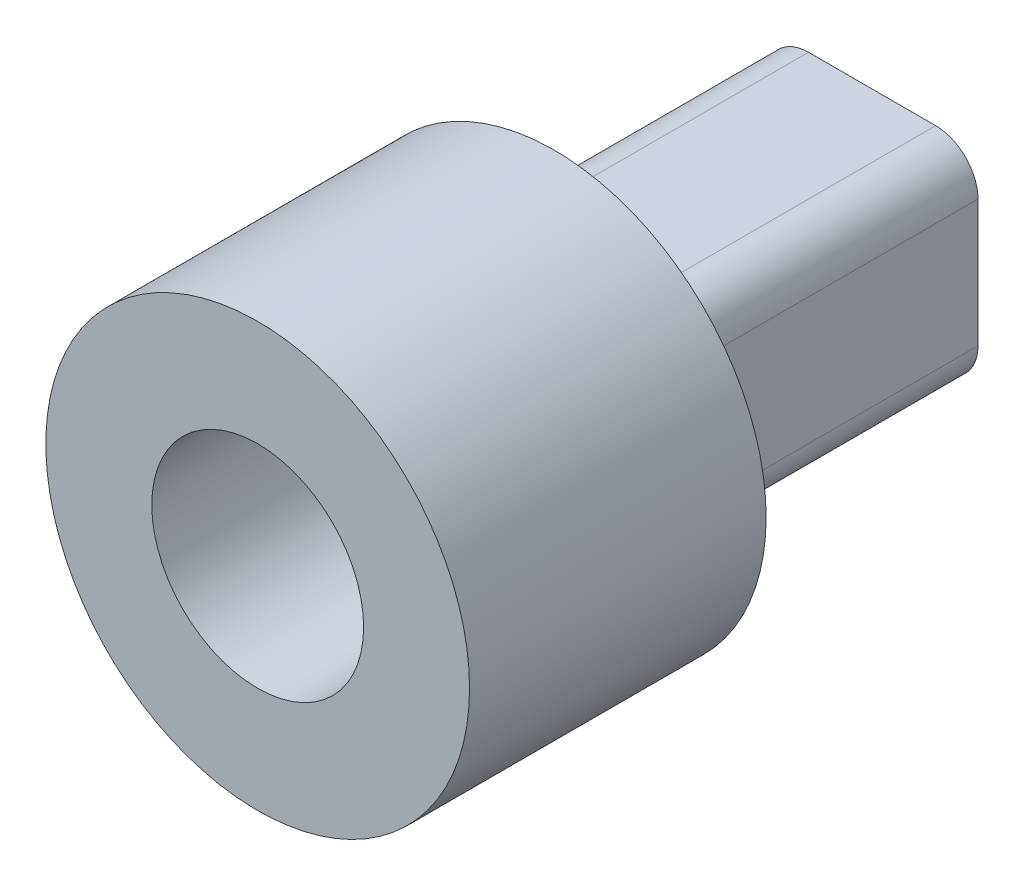
ISO-10303-21;
HEADER;
FILE_DESCRIPTION(('STEP AP214'),'2;1');
FILE_NAME('part.step','',(''),(''),'','','');
FILE_SCHEMA(('AUTOMOTIVE_DESIGN { 1 0 10303 214 1 1 1 1 }'));
ENDSEC;
DATA;
#1=APPLICATION_CONTEXT('core data for automotive mechanical design processes');
#2=APPLICATION_PROTOCOL_DEFINITION('international standard','automotive_design',2000,#1);
#3=PRODUCT_CONTEXT('',#1,'mechanical');
#4=PRODUCT('Part','Part','',(#3));
#5=PRODUCT_RELATED_PRODUCT_CATEGORY('part','',(#4));
#6=PRODUCT_DEFINITION_FORMATION('','',#4);
#7=PRODUCT_DEFINITION_CONTEXT('part definition',#1,'design');
#8=PRODUCT_DEFINITION('design','',#6,#7);
#9=PRODUCT_DEFINITION_SHAPE('','',#8);
#10=(LENGTH_UNIT() NAMED_UNIT(*) SI_UNIT(.MILLI.,.METRE.));
#11=(NAMED_UNIT(*) PLANE_ANGLE_UNIT() SI_UNIT($,.RADIAN.));
#12=(NAMED_UNIT(*) SI_UNIT($,.STERADIAN.) SOLID_ANGLE_UNIT());
#13=UNCERTAINTY_MEASURE_WITH_UNIT(LENGTH_MEASURE(1.E-05),#10,'distance_accuracy_value','');
#14=(GEOMETRIC_REPRESENTATION_CONTEXT(3) GLOBAL_UNCERTAINTY_ASSIGNED_CONTEXT((#13)) GLOBAL_UNIT_ASSIGNED_CONTEXT((#10,
#11,#12)) REPRESENTATION_CONTEXT('',''));
#15=CARTESIAN_POINT('',(0.,0.,0.));
#16=DIRECTION('',(0.,0.,1.));
#17=DIRECTION('',(1.,0.,0.));
#18=AXIS2_PLACEMENT_3D('',#15,#16,#17);
#19=CARTESIAN_POINT('',(1.5,1.50000000000001,7.5));
#20=DIRECTION('',(0.,0.,-1.));
#21=DIRECTION('',(-1.,0.,0.));
#22=AXIS2_PLACEMENT_3D('',#19,#20,#21);
#23=CYLINDRICAL_SURFACE('',#22,1.);
#24=DIRECTION('',(0.,0.,-1.));
#25=VECTOR('',#24,1.);
#26=CARTESIAN_POINT('',(1.5,2.50000000000001,7.5));
#27=LINE('',#26,#25);
#28=CARTESIAN_POINT('',(1.5,2.50000000000001,6.5));
#29=VERTEX_POINT('',#28);
#30=CARTESIAN_POINT('',(1.5,2.50000000000001,0.));
#31=VERTEX_POINT('',#30);
#32=EDGE_CURVE('E128',#29,#31,#27,.T.);
#33=ORIENTED_EDGE('',*,*,#32,.F.);
#34=CARTESIAN_POINT('',(1.5,1.50000000000001,6.5));
#35=DIRECTION('',(0.,0.,1.));
#36=DIRECTION('',(1.,0.,0.));
#37=AXIS2_PLACEMENT_3D('',#34,#35,#36);
#38=CIRCLE('',#37,1.);
#39=CARTESIAN_POINT('',(2.5,1.5,6.5));
#40=VERTEX_POINT('',#39);
#41=EDGE_CURVE('E207',#29,#40,#38,.F.);
#42=ORIENTED_EDGE('',*,*,#41,.T.);
#43=DIRECTION('',(0.,0.,-1.));
#44=VECTOR('',#43,1.);
#45=CARTESIAN_POINT('',(2.5,1.5,7.5));
#46=LINE('',#45,#44);
#47=CARTESIAN_POINT('',(2.5,1.5,0.));
#48=VERTEX_POINT('',#47);
#49=EDGE_CURVE('E151',#40,#48,#46,.T.);
#50=ORIENTED_EDGE('',*,*,#49,.T.);
#51=CARTESIAN_POINT('',(1.5,1.50000000000001,0.));
#52=DIRECTION('',(0.,0.,1.));
#53=DIRECTION('',(-1.,0.,0.));
#54=AXIS2_PLACEMENT_3D('',#51,#52,#53);
#55=CIRCLE('',#54,1.);
#56=EDGE_CURVE('E145',#48,#31,#55,.T.);
#57=ORIENTED_EDGE('',*,*,#56,.T.);
#58=EDGE_LOOP('',(#33,#42,#50,#57));
#59=FACE_BOUND('',#58,.T.);
#60=ADVANCED_FACE('F37',(#59),#23,.T.);
#61=CARTESIAN_POINT('',(-1.49999999999999,2.50000000000001,7.5));
#62=DIRECTION('',(0.,-1.,0.));
#63=DIRECTION('',(0.,0.,-1.));
#64=AXIS2_PLACEMENT_3D('',#61,#62,#63);
#65=PLANE('',#64);
#66=DIRECTION('',(0.,0.,-1.));
#67=VECTOR('',#66,1.);
#68=CARTESIAN_POINT('',(-1.49999999999999,2.50000000000001,7.5));
#69=LINE('',#68,#67);
#70=CARTESIAN_POINT('',(-1.49999999999999,2.50000000000001,6.5));
#71=VERTEX_POINT('',#70);
#72=CARTESIAN_POINT('',(-1.49999999999999,2.50000000000001,0.));
#73=VERTEX_POINT('',#72);
#74=EDGE_CURVE('E139',#71,#73,#69,.T.);
#75=ORIENTED_EDGE('',*,*,#74,.F.);
#76=DIRECTION('',(-1.,0.,0.));
#77=VECTOR('',#76,1.);
#78=CARTESIAN_POINT('',(1.5,2.50000000000001,6.5));
#79=LINE('',#78,#77);
#80=EDGE_CURVE('E135',#71,#29,#79,.F.);
#81=ORIENTED_EDGE('',*,*,#80,.T.);
#82=ORIENTED_EDGE('',*,*,#32,.T.);
#83=DIRECTION('',(-1.,0.,0.));
#84=VECTOR('',#83,1.);
#85=CARTESIAN_POINT('',(-1.49999999999999,2.50000000000001,0.));
#86=LINE('',#85,#84);
#87=EDGE_CURVE('E132',#31,#73,#86,.T.);
#88=ORIENTED_EDGE('',*,*,#87,.T.);
#89=EDGE_LOOP('',(#75,#81,#82,#88));
#90=FACE_BOUND('',#89,.T.);
#91=ADVANCED_FACE('F131',(#90),#65,.F.);
#92=CARTESIAN_POINT('',(-1.5,1.50000000000001,7.5));
#93=DIRECTION('',(0.,0.,-1.));
#94=DIRECTION('',(-1.,0.,0.));
#95=AXIS2_PLACEMENT_3D('',#92,#93,#94);
#96=CYLINDRICAL_SURFACE('',#95,1.);
#97=DIRECTION('',(0.,0.,-1.));
#98=VECTOR('',#97,1.);
#99=CARTESIAN_POINT('',(-2.5,1.5,7.5));
#100=LINE('',#99,#98);
#101=CARTESIAN_POINT('',(-2.5,1.5,6.5));
#102=VERTEX_POINT('',#101);
#103=CARTESIAN_POINT('',(-2.5,1.5,0.));
#104=VERTEX_POINT('',#103);
#105=EDGE_CURVE('E184',#102,#104,#100,.T.);
#106=ORIENTED_EDGE('',*,*,#105,.F.);
#107=CARTESIAN_POINT('',(-1.5,1.50000000000001,6.5));
#108=DIRECTION('',(0.,0.,1.));
#109=DIRECTION('',(1.,0.,0.));
#110=AXIS2_PLACEMENT_3D('',#107,#108,#109);
#111=CIRCLE('',#110,1.);
#112=EDGE_CURVE('E11',#102,#71,#111,.F.);
#113=ORIENTED_EDGE('',*,*,#112,.T.);
#114=ORIENTED_EDGE('',*,*,#74,.T.);
#115=CARTESIAN_POINT('',(-1.5,1.50000000000001,0.));
#116=DIRECTION('',(0.,0.,1.));
#117=DIRECTION('',(-1.,0.,0.));
#118=AXIS2_PLACEMENT_3D('',#115,#116,#117);
#119=CIRCLE('',#118,1.);
#120=EDGE_CURVE('E148',#73,#104,#119,.T.);
#121=ORIENTED_EDGE('',*,*,#120,.T.);
#122=EDGE_LOOP('',(#106,#113,#114,#121));
#123=FACE_BOUND('',#122,.T.);
#124=ADVANCED_FACE('F271',(#123),#96,.T.);
#125=CARTESIAN_POINT('',(-2.5,-1.49999999999999,7.5));
#126=DIRECTION('',(1.,0.,0.));
#127=DIRECTION('',(0.,0.,-1.));
#128=AXIS2_PLACEMENT_3D('',#125,#126,#127);
#129=PLANE('',#128);
#130=DIRECTION('',(0.,0.,-1.));
#131=VECTOR('',#130,1.);
#132=CARTESIAN_POINT('',(-2.5,-1.49999999999999,7.5));
#133=LINE('',#132,#131);
#134=CARTESIAN_POINT('',(-2.5,-1.49999999999999,6.5));
#135=VERTEX_POINT('',#134);
#136=CARTESIAN_POINT('',(-2.5,-1.49999999999999,0.));
#137=VERTEX_POINT('',#136);
#138=EDGE_CURVE('E182',#135,#137,#133,.T.);
#139=ORIENTED_EDGE('',*,*,#138,.F.);
#140=DIRECTION('',(0.,-1.,0.));
#141=VECTOR('',#140,1.);
#142=CARTESIAN_POINT('',(-2.5,1.5,6.5));
#143=LINE('',#142,#141);
#144=EDGE_CURVE('E46',#135,#102,#143,.F.);
#145=ORIENTED_EDGE('',*,*,#144,.T.);
#146=ORIENTED_EDGE('',*,*,#105,.T.);
#147=DIRECTION('',(0.,-1.,0.));
#148=VECTOR('',#147,1.);
#149=CARTESIAN_POINT('',(-2.5,-1.49999999999999,0.));
#150=LINE('',#149,#148);
#151=EDGE_CURVE('E161',#104,#137,#150,.T.);
#152=ORIENTED_EDGE('',*,*,#151,.T.);
#153=EDGE_LOOP('',(#139,#145,#146,#152));
#154=FACE_BOUND('',#153,.T.);
#155=ADVANCED_FACE('F338',(#154),#129,.F.);
#156=CARTESIAN_POINT('',(-1.5,-1.5,7.5));
#157=DIRECTION('',(0.,0.,-1.));
#158=DIRECTION('',(-1.,0.,0.));
#159=AXIS2_PLACEMENT_3D('',#156,#157,#158);
#160=CYLINDRICAL_SURFACE('',#159,1.);
#161=DIRECTION('',(0.,0.,-1.));
#162=VECTOR('',#161,1.);
#163=CARTESIAN_POINT('',(-1.49999999999999,-2.5,7.5));
#164=LINE('',#163,#162);
#165=CARTESIAN_POINT('',(-1.49999999999999,-2.5,6.5));
#166=VERTEX_POINT('',#165);
#167=CARTESIAN_POINT('',(-1.49999999999999,-2.5,0.));
#168=VERTEX_POINT('',#167);
#169=EDGE_CURVE('E180',#166,#168,#164,.T.);
#170=ORIENTED_EDGE('',*,*,#169,.F.);
#171=CARTESIAN_POINT('',(-1.5,-1.5,6.5));
#172=DIRECTION('',(0.,0.,1.));
#173=DIRECTION('',(1.,0.,0.));
#174=AXIS2_PLACEMENT_3D('',#171,#172,#173);
#175=CIRCLE('',#174,1.);
#176=EDGE_CURVE('E61',#166,#135,#175,.F.);
#177=ORIENTED_EDGE('',*,*,#176,.T.);
#178=ORIENTED_EDGE('',*,*,#138,.T.);
#179=CARTESIAN_POINT('',(-1.5,-1.5,0.));
#180=DIRECTION('',(0.,0.,1.));
#181=DIRECTION('',(-1.,0.,0.));
#182=AXIS2_PLACEMENT_3D('',#179,#180,#181);
#183=CIRCLE('',#182,1.);
#184=EDGE_CURVE('E164',#137,#168,#183,.T.);
#185=ORIENTED_EDGE('',*,*,#184,.T.);
#186=EDGE_LOOP('',(#170,#177,#178,#185));
#187=FACE_BOUND('',#186,.T.);
#188=ADVANCED_FACE('F337',(#187),#160,.T.);
#189=CARTESIAN_POINT('',(-1.49999999999999,-2.5,7.5));
#190=DIRECTION('',(0.,1.,0.));
#191=DIRECTION('',(0.,0.,1.));
#192=AXIS2_PLACEMENT_3D('',#189,#190,#191);
#193=PLANE('',#192);
#194=DIRECTION('',(0.,0.,-1.));
#195=VECTOR('',#194,1.);
#196=CARTESIAN_POINT('',(1.5,-2.5,7.5));
#197=LINE('',#196,#195);
#198=CARTESIAN_POINT('',(1.5,-2.5,6.5));
#199=VERTEX_POINT('',#198);
#200=CARTESIAN_POINT('',(1.5,-2.5,0.));
#201=VERTEX_POINT('',#200);
#202=EDGE_CURVE('E178',#199,#201,#197,.T.);
#203=ORIENTED_EDGE('',*,*,#202,.F.);
#204=DIRECTION('',(1.,0.,0.));
#205=VECTOR('',#204,1.);
#206=CARTESIAN_POINT('',(-1.49999999999999,-2.5,6.5));
#207=LINE('',#206,#205);
#208=EDGE_CURVE('E213',#199,#166,#207,.F.);
#209=ORIENTED_EDGE('',*,*,#208,.T.);
#210=ORIENTED_EDGE('',*,*,#169,.T.);
#211=DIRECTION('',(1.,0.,0.));
#212=VECTOR('',#211,1.);
#213=CARTESIAN_POINT('',(-1.49999999999999,-2.5,0.));
#214=LINE('',#213,#212);
#215=EDGE_CURVE('E167',#168,#201,#214,.T.);
#216=ORIENTED_EDGE('',*,*,#215,.T.);
#217=EDGE_LOOP('',(#203,#209,#210,#216));
#218=FACE_BOUND('',#217,.T.);
#219=ADVANCED_FACE('F333',(#218),#193,.F.);
#220=CARTESIAN_POINT('',(1.5,-1.5,7.5));
#221=DIRECTION('',(0.,0.,-1.));
#222=DIRECTION('',(-1.,0.,0.));
#223=AXIS2_PLACEMENT_3D('',#220,#221,#222);
#224=CYLINDRICAL_SURFACE('',#223,1.);
#225=DIRECTION('',(0.,0.,-1.));
#226=VECTOR('',#225,1.);
#227=CARTESIAN_POINT('',(2.5,-1.5,7.5));
#228=LINE('',#227,#226);
#229=CARTESIAN_POINT('',(2.5,-1.5,6.5));
#230=VERTEX_POINT('',#229);
#231=CARTESIAN_POINT('',(2.5,-1.5,0.));
#232=VERTEX_POINT('',#231);
#233=EDGE_CURVE('E176',#230,#232,#228,.T.);
#234=ORIENTED_EDGE('',*,*,#233,.F.);
#235=CARTESIAN_POINT('',(1.5,-1.5,6.5));
#236=DIRECTION('',(0.,0.,1.));
#237=DIRECTION('',(1.,0.,0.));
#238=AXIS2_PLACEMENT_3D('',#235,#236,#237);
#239=CIRCLE('',#238,1.);
#240=EDGE_CURVE('E211',#230,#199,#239,.F.);
#241=ORIENTED_EDGE('',*,*,#240,.T.);
#242=ORIENTED_EDGE('',*,*,#202,.T.);
#243=CARTESIAN_POINT('',(1.5,-1.5,0.));
#244=DIRECTION('',(0.,0.,1.));
#245=DIRECTION('',(1.,0.,0.));
#246=AXIS2_PLACEMENT_3D('',#243,#244,#245);
#247=CIRCLE('',#246,1.);
#248=EDGE_CURVE('E170',#201,#232,#247,.T.);
#249=ORIENTED_EDGE('',*,*,#248,.T.);
#250=EDGE_LOOP('',(#234,#241,#242,#249));
#251=FACE_BOUND('',#250,.T.);
#252=ADVANCED_FACE('F331',(#251),#224,.T.);
#253=CARTESIAN_POINT('',(2.5,-1.49999999999999,7.5));
#254=DIRECTION('',(-1.,0.,0.));
#255=DIRECTION('',(0.,0.,1.));
#256=AXIS2_PLACEMENT_3D('',#253,#254,#255);
#257=PLANE('',#256);
#258=ORIENTED_EDGE('',*,*,#49,.F.);
#259=DIRECTION('',(0.,1.,0.));
#260=VECTOR('',#259,1.);
#261=CARTESIAN_POINT('',(2.5,-1.5,6.5));
#262=LINE('',#261,#260);
#263=EDGE_CURVE('E209',#40,#230,#262,.F.);
#264=ORIENTED_EDGE('',*,*,#263,.T.);
#265=ORIENTED_EDGE('',*,*,#233,.T.);
#266=DIRECTION('',(0.,1.,0.));
#267=VECTOR('',#266,1.);
#268=CARTESIAN_POINT('',(2.5,-1.49999999999999,0.));
#269=LINE('',#268,#267);
#270=EDGE_CURVE('E173',#232,#48,#269,.T.);
#271=ORIENTED_EDGE('',*,*,#270,.T.);
#272=EDGE_LOOP('',(#258,#264,#265,#271));
#273=FACE_BOUND('',#272,.T.);
#274=ADVANCED_FACE('F325',(#273),#257,.F.);
#275=CARTESIAN_POINT('',(1.5,1.50000000000001,0.));
#276=DIRECTION('',(0.,0.,-1.));
#277=DIRECTION('',(-1.,0.,0.));
#278=AXIS2_PLACEMENT_3D('',#275,#276,#277);
#279=PLANE('',#278);
#280=ORIENTED_EDGE('',*,*,#56,.F.);
#281=ORIENTED_EDGE('',*,*,#270,.F.);
#282=ORIENTED_EDGE('',*,*,#248,.F.);
#283=ORIENTED_EDGE('',*,*,#215,.F.);
#284=ORIENTED_EDGE('',*,*,#184,.F.);
#285=ORIENTED_EDGE('',*,*,#151,.F.);
#286=ORIENTED_EDGE('',*,*,#120,.F.);
#287=ORIENTED_EDGE('',*,*,#87,.F.);
#288=EDGE_LOOP('',(#280,#281,#282,#283,#284,#285,#286,#287));
#289=FACE_BOUND('',#288,.T.);
#290=ADVANCED_FACE('F143',(#289),#279,.T.);
#291=CARTESIAN_POINT('',(0.,0.,7.5));
#292=DIRECTION('',(0.,0.,1.));
#293=DIRECTION('',(1.,0.,0.));
#294=AXIS2_PLACEMENT_3D('',#291,#292,#293);
#295=PLANE('',#294);
#296=CARTESIAN_POINT('',(1.5,1.50000000000001,7.5));
#297=DIRECTION('',(0.,0.,1.));
#298=DIRECTION('',(1.,0.,0.));
#299=AXIS2_PLACEMENT_3D('',#296,#297,#298);
#300=CIRCLE('',#299,2.);
#301=CARTESIAN_POINT('',(3.5,1.49999999999999,7.5));
#302=VERTEX_POINT('',#301);
#303=CARTESIAN_POINT('',(1.5,3.50000000000001,7.5));
#304=VERTEX_POINT('',#303);
#305=EDGE_CURVE('E201',#302,#304,#300,.T.);
#306=ORIENTED_EDGE('',*,*,#305,.T.);
#307=DIRECTION('',(-1.,0.,0.));
#308=VECTOR('',#307,1.);
#309=CARTESIAN_POINT('',(-1.49999999999999,3.50000000000001,7.5));
#310=LINE('',#309,#308);
#311=CARTESIAN_POINT('',(-1.49999999999999,3.50000000000001,7.5));
#312=VERTEX_POINT('',#311);
#313=EDGE_CURVE('E203',#304,#312,#310,.T.);
#314=ORIENTED_EDGE('',*,*,#313,.T.);
#315=CARTESIAN_POINT('',(-1.5,1.50000000000001,7.5));
#316=DIRECTION('',(0.,0.,1.));
#317=DIRECTION('',(1.,0.,0.));
#318=AXIS2_PLACEMENT_3D('',#315,#316,#317);
#319=CIRCLE('',#318,2.);
#320=CARTESIAN_POINT('',(-3.5,1.5,7.5));
#321=VERTEX_POINT('',#320);
#322=EDGE_CURVE('E189',#312,#321,#319,.T.);
#323=ORIENTED_EDGE('',*,*,#322,.T.);
#324=DIRECTION('',(0.,-1.,0.));
#325=VECTOR('',#324,1.);
#326=CARTESIAN_POINT('',(-3.5,-1.49999999999999,7.5));
#327=LINE('',#326,#325);
#328=CARTESIAN_POINT('',(-3.5,-1.49999999999998,7.5));
#329=VERTEX_POINT('',#328);
#330=EDGE_CURVE('E191',#321,#329,#327,.T.);
#331=ORIENTED_EDGE('',*,*,#330,.T.);
#332=CARTESIAN_POINT('',(-1.5,-1.5,7.5));
#333=DIRECTION('',(0.,0.,1.));
#334=DIRECTION('',(1.,0.,0.));
#335=AXIS2_PLACEMENT_3D('',#332,#333,#334);
#336=CIRCLE('',#335,2.);
#337=CARTESIAN_POINT('',(-1.49999999999999,-3.5,7.5));
#338=VERTEX_POINT('',#337);
#339=EDGE_CURVE('E193',#329,#338,#336,.T.);
#340=ORIENTED_EDGE('',*,*,#339,.T.);
#341=DIRECTION('',(1.,0.,0.));
#342=VECTOR('',#341,1.);
#343=CARTESIAN_POINT('',(1.5,-3.5,7.5));
#344=LINE('',#343,#342);
#345=CARTESIAN_POINT('',(1.49999999999999,-3.5,7.5));
#346=VERTEX_POINT('',#345);
#347=EDGE_CURVE('E195',#338,#346,#344,.T.);
#348=ORIENTED_EDGE('',*,*,#347,.T.);
#349=CARTESIAN_POINT('',(1.5,-1.5,7.5));
#350=DIRECTION('',(0.,0.,1.));
#351=DIRECTION('',(1.,0.,0.));
#352=AXIS2_PLACEMENT_3D('',#349,#350,#351);
#353=CIRCLE('',#352,2.);
#354=CARTESIAN_POINT('',(3.5,-1.5,7.5));
#355=VERTEX_POINT('',#354);
#356=EDGE_CURVE('E197',#346,#355,#353,.T.);
#357=ORIENTED_EDGE('',*,*,#356,.T.);
#358=DIRECTION('',(0.,1.,0.));
#359=VECTOR('',#358,1.);
#360=CARTESIAN_POINT('',(3.5,1.5,7.5));
#361=LINE('',#360,#359);
#362=EDGE_CURVE('E199',#355,#302,#361,.T.);
#363=ORIENTED_EDGE('',*,*,#362,.T.);
#364=EDGE_LOOP('',(#306,#314,#323,#331,#340,#348,#357,#363));
#365=FACE_BOUND('',#364,.T.);
#366=CARTESIAN_POINT('',(0.,0.,7.5));
#367=DIRECTION('',(0.,0.,1.));
#368=DIRECTION('',(1.,0.,0.));
#369=AXIS2_PLACEMENT_3D('',#366,#367,#368);
#370=CIRCLE('',#369,5.);
#371=CARTESIAN_POINT('',(5.,0.,7.5));
#372=VERTEX_POINT('',#371);
#373=EDGE_CURVE('E153',#372,#372,#370,.T.);
#374=ORIENTED_EDGE('',*,*,#373,.F.);
#375=EDGE_LOOP('',(#374));
#376=FACE_BOUND('',#375,.T.);
#377=ADVANCED_FACE('F255',(#365,#376),#295,.F.);
#378=CARTESIAN_POINT('',(0.,0.,9.5));
#379=DIRECTION('',(0.,0.,-1.));
#380=DIRECTION('',(-1.,0.,0.));
#381=AXIS2_PLACEMENT_3D('',#378,#379,#380);
#382=CYLINDRICAL_SURFACE('',#381,5.);
#383=ORIENTED_EDGE('',*,*,#373,.T.);
#384=EDGE_LOOP('',(#383));
#385=FACE_BOUND('',#384,.T.);
#386=CARTESIAN_POINT('',(0.,0.,14.5));
#387=DIRECTION('',(0.,0.,1.));
#388=DIRECTION('',(1.,0.,0.));
#389=AXIS2_PLACEMENT_3D('',#386,#387,#388);
#390=CIRCLE('',#389,5.);
#391=CARTESIAN_POINT('',(5.,0.,14.5));
#392=VERTEX_POINT('',#391);
#393=EDGE_CURVE('E156',#392,#392,#390,.T.);
#394=ORIENTED_EDGE('',*,*,#393,.F.);
#395=EDGE_LOOP('',(#394));
#396=FACE_BOUND('',#395,.T.);
#397=ADVANCED_FACE('F252',(#385,#396),#382,.T.);
#398=CARTESIAN_POINT('',(0.,0.,14.5));
#399=DIRECTION('',(0.,0.,-1.));
#400=DIRECTION('',(-1.,0.,0.));
#401=AXIS2_PLACEMENT_3D('',#398,#399,#400);
#402=CYLINDRICAL_SURFACE('',#401,2.5);
#403=CARTESIAN_POINT('',(0.,0.,14.5));
#404=DIRECTION('',(0.,0.,1.));
#405=DIRECTION('',(1.,0.,0.));
#406=AXIS2_PLACEMENT_3D('',#403,#404,#405);
#407=CIRCLE('',#406,2.5);
#408=CARTESIAN_POINT('',(2.5,0.,14.5));
#409=VERTEX_POINT('',#408);
#410=EDGE_CURVE('E238',#409,#409,#407,.T.);
#411=ORIENTED_EDGE('',*,*,#410,.T.);
#412=EDGE_LOOP('',(#411));
#413=FACE_BOUND('',#412,.T.);
#414=CARTESIAN_POINT('',(0.,0.,9.5));
#415=DIRECTION('',(0.,0.,1.));
#416=DIRECTION('',(1.,0.,0.));
#417=AXIS2_PLACEMENT_3D('',#414,#415,#416);
#418=CIRCLE('',#417,2.5);
#419=CARTESIAN_POINT('',(2.5,0.,9.5));
#420=VERTEX_POINT('',#419);
#421=EDGE_CURVE('E138',#420,#420,#418,.F.);
#422=ORIENTED_EDGE('',*,*,#421,.T.);
#423=EDGE_LOOP('',(#422));
#424=FACE_BOUND('',#423,.T.);
#425=ADVANCED_FACE('F254',(#413,#424),#402,.F.);
#426=CARTESIAN_POINT('',(0.,0.,14.5));
#427=DIRECTION('',(0.,0.,1.));
#428=DIRECTION('',(1.,0.,0.));
#429=AXIS2_PLACEMENT_3D('',#426,#427,#428);
#430=PLANE('',#429);
#431=ORIENTED_EDGE('',*,*,#410,.F.);
#432=EDGE_LOOP('',(#431));
#433=FACE_BOUND('',#432,.T.);
#434=ORIENTED_EDGE('',*,*,#393,.T.);
#435=EDGE_LOOP('',(#434));
#436=FACE_BOUND('',#435,.T.);
#437=ADVANCED_FACE('F250',(#433,#436),#430,.T.);
#438=CARTESIAN_POINT('',(0.,0.,9.5));
#439=DIRECTION('',(0.,0.,1.));
#440=DIRECTION('',(1.,0.,0.));
#441=AXIS2_PLACEMENT_3D('',#438,#439,#440);
#442=PLANE('',#441);
#443=ORIENTED_EDGE('',*,*,#421,.F.);
#444=EDGE_LOOP('',(#443));
#445=FACE_BOUND('',#444,.T.);
#446=ADVANCED_FACE('F302',(#445),#442,.T.);
#447=CARTESIAN_POINT('',(0.,-3.5,6.5));
#448=DIRECTION('',(-1.,0.,0.));
#449=DIRECTION('',(0.,0.,1.));
#450=AXIS2_PLACEMENT_3D('',#447,#448,#449);
#451=CYLINDRICAL_SURFACE('',#450,1.);
#452=CARTESIAN_POINT('',(-1.49999999999999,-3.5,6.5));
#453=DIRECTION('',(1.,0.,0.));
#454=DIRECTION('',(0.,0.,-1.));
#455=AXIS2_PLACEMENT_3D('',#452,#453,#454);
#456=CIRCLE('',#455,1.);
#457=EDGE_CURVE('E232',#166,#338,#456,.T.);
#458=ORIENTED_EDGE('',*,*,#457,.F.);
#459=ORIENTED_EDGE('',*,*,#208,.F.);
#460=CARTESIAN_POINT('',(1.49999999999999,-3.5,6.5));
#461=DIRECTION('',(-1.,0.,0.));
#462=DIRECTION('',(0.,-1.,0.));
#463=AXIS2_PLACEMENT_3D('',#460,#461,#462);
#464=CIRCLE('',#463,1.);
#465=EDGE_CURVE('E41',#346,#199,#464,.T.);
#466=ORIENTED_EDGE('',*,*,#465,.F.);
#467=ORIENTED_EDGE('',*,*,#347,.F.);
#468=EDGE_LOOP('',(#458,#459,#466,#467));
#469=FACE_BOUND('',#468,.T.);
#470=ADVANCED_FACE('F39',(#469),#451,.F.);
#471=CARTESIAN_POINT('',(1.5,-1.5,6.5));
#472=DIRECTION('',(0.,0.,1.));
#473=DIRECTION('',(1.,0.,0.));
#474=AXIS2_PLACEMENT_3D('',#471,#472,#473);
#475=TOROIDAL_SURFACE('',#474,2.,1.);
#476=ORIENTED_EDGE('',*,*,#465,.T.);
#477=ORIENTED_EDGE('',*,*,#240,.F.);
#478=CARTESIAN_POINT('',(3.5,-1.5,6.5));
#479=DIRECTION('',(0.,-1.,0.));
#480=DIRECTION('',(0.,0.,-1.));
#481=AXIS2_PLACEMENT_3D('',#478,#479,#480);
#482=CIRCLE('',#481,1.);
#483=EDGE_CURVE('E230',#355,#230,#482,.T.);
#484=ORIENTED_EDGE('',*,*,#483,.F.);
#485=ORIENTED_EDGE('',*,*,#356,.F.);
#486=EDGE_LOOP('',(#476,#477,#484,#485));
#487=FACE_BOUND('',#486,.T.);
#488=ADVANCED_FACE('F297',(#487),#475,.F.);
#489=CARTESIAN_POINT('',(-1.5,-1.5,6.5));
#490=DIRECTION('',(0.,0.,1.));
#491=DIRECTION('',(1.,0.,0.));
#492=AXIS2_PLACEMENT_3D('',#489,#490,#491);
#493=TOROIDAL_SURFACE('',#492,2.,1.);
#494=ORIENTED_EDGE('',*,*,#457,.T.);
#495=ORIENTED_EDGE('',*,*,#339,.F.);
#496=CARTESIAN_POINT('',(-3.5,-1.49999999999998,6.5));
#497=DIRECTION('',(0.,-1.,0.));
#498=DIRECTION('',(1.,0.,0.));
#499=AXIS2_PLACEMENT_3D('',#496,#497,#498);
#500=CIRCLE('',#499,1.);
#501=EDGE_CURVE('E227',#135,#329,#500,.T.);
#502=ORIENTED_EDGE('',*,*,#501,.F.);
#503=ORIENTED_EDGE('',*,*,#176,.F.);
#504=EDGE_LOOP('',(#494,#495,#502,#503));
#505=FACE_BOUND('',#504,.T.);
#506=ADVANCED_FACE('F294',(#505),#493,.F.);
#507=CARTESIAN_POINT('',(3.5,0.,6.5));
#508=DIRECTION('',(0.,-1.,0.));
#509=DIRECTION('',(0.,0.,-1.));
#510=AXIS2_PLACEMENT_3D('',#507,#508,#509);
#511=CYLINDRICAL_SURFACE('',#510,1.);
#512=ORIENTED_EDGE('',*,*,#483,.T.);
#513=ORIENTED_EDGE('',*,*,#263,.F.);
#514=CARTESIAN_POINT('',(3.5,1.49999999999999,6.5));
#515=DIRECTION('',(0.,-1.,0.));
#516=DIRECTION('',(1.,0.,0.));
#517=AXIS2_PLACEMENT_3D('',#514,#515,#516);
#518=CIRCLE('',#517,1.);
#519=EDGE_CURVE('E224',#302,#40,#518,.T.);
#520=ORIENTED_EDGE('',*,*,#519,.F.);
#521=ORIENTED_EDGE('',*,*,#362,.F.);
#522=EDGE_LOOP('',(#512,#513,#520,#521));
#523=FACE_BOUND('',#522,.T.);
#524=ADVANCED_FACE('F290',(#523),#511,.F.);
#525=CARTESIAN_POINT('',(-3.5,0.,6.5));
#526=DIRECTION('',(0.,1.,0.));
#527=DIRECTION('',(0.,0.,1.));
#528=AXIS2_PLACEMENT_3D('',#525,#526,#527);
#529=CYLINDRICAL_SURFACE('',#528,1.);
#530=ORIENTED_EDGE('',*,*,#501,.T.);
#531=ORIENTED_EDGE('',*,*,#330,.F.);
#532=CARTESIAN_POINT('',(-3.5,1.5,6.5));
#533=DIRECTION('',(0.,-1.,0.));
#534=DIRECTION('',(0.,0.,-1.));
#535=AXIS2_PLACEMENT_3D('',#532,#533,#534);
#536=CIRCLE('',#535,1.);
#537=EDGE_CURVE('E221',#102,#321,#536,.T.);
#538=ORIENTED_EDGE('',*,*,#537,.F.);
#539=ORIENTED_EDGE('',*,*,#144,.F.);
#540=EDGE_LOOP('',(#530,#531,#538,#539));
#541=FACE_BOUND('',#540,.T.);
#542=ADVANCED_FACE('F286',(#541),#529,.F.);
#543=CARTESIAN_POINT('',(1.5,1.50000000000001,6.5));
#544=DIRECTION('',(0.,0.,1.));
#545=DIRECTION('',(1.,0.,0.));
#546=AXIS2_PLACEMENT_3D('',#543,#544,#545);
#547=TOROIDAL_SURFACE('',#546,2.,1.);
#548=ORIENTED_EDGE('',*,*,#519,.T.);
#549=ORIENTED_EDGE('',*,*,#41,.F.);
#550=CARTESIAN_POINT('',(1.5,3.50000000000001,6.5));
#551=DIRECTION('',(1.,0.,0.));
#552=DIRECTION('',(0.,0.,-1.));
#553=AXIS2_PLACEMENT_3D('',#550,#551,#552);
#554=CIRCLE('',#553,1.);
#555=EDGE_CURVE('E219',#304,#29,#554,.T.);
#556=ORIENTED_EDGE('',*,*,#555,.F.);
#557=ORIENTED_EDGE('',*,*,#305,.F.);
#558=EDGE_LOOP('',(#548,#549,#556,#557));
#559=FACE_BOUND('',#558,.T.);
#560=ADVANCED_FACE('F282',(#559),#547,.F.);
#561=CARTESIAN_POINT('',(-1.5,1.50000000000001,6.5));
#562=DIRECTION('',(0.,0.,1.));
#563=DIRECTION('',(1.,0.,0.));
#564=AXIS2_PLACEMENT_3D('',#561,#562,#563);
#565=TOROIDAL_SURFACE('',#564,2.,1.);
#566=ORIENTED_EDGE('',*,*,#537,.T.);
#567=ORIENTED_EDGE('',*,*,#322,.F.);
#568=CARTESIAN_POINT('',(-1.49999999999998,3.50000000000001,6.5));
#569=DIRECTION('',(-1.,0.,0.));
#570=DIRECTION('',(0.,0.,1.));
#571=AXIS2_PLACEMENT_3D('',#568,#569,#570);
#572=CIRCLE('',#571,1.);
#573=EDGE_CURVE('E217',#71,#312,#572,.T.);
#574=ORIENTED_EDGE('',*,*,#573,.F.);
#575=ORIENTED_EDGE('',*,*,#112,.F.);
#576=EDGE_LOOP('',(#566,#567,#574,#575));
#577=FACE_BOUND('',#576,.T.);
#578=ADVANCED_FACE('F278',(#577),#565,.F.);
#579=CARTESIAN_POINT('',(0.,3.50000000000001,6.5));
#580=DIRECTION('',(1.,0.,0.));
#581=DIRECTION('',(0.,0.,-1.));
#582=AXIS2_PLACEMENT_3D('',#579,#580,#581);
#583=CYLINDRICAL_SURFACE('',#582,1.);
#584=ORIENTED_EDGE('',*,*,#555,.T.);
#585=ORIENTED_EDGE('',*,*,#80,.F.);
#586=ORIENTED_EDGE('',*,*,#573,.T.);
#587=ORIENTED_EDGE('',*,*,#313,.F.);
#588=EDGE_LOOP('',(#584,#585,#586,#587));
#589=FACE_BOUND('',#588,.T.);
#590=ADVANCED_FACE('F275',(#589),#583,.F.);
#591=CLOSED_SHELL('',(#60,#91,#124,#155,#188,#219,#252,#274,#290,#377,#397,#425,#437,#446,#470,
#488,#506,#524,#542,#560,#578,#590));
#592=MANIFOLD_SOLID_BREP('B2',#591);
#593=ADVANCED_BREP_SHAPE_REPRESENTATION('',(#18,#592),#14);
#594=SHAPE_DEFINITION_REPRESENTATION(#9,#593);
ENDSEC;
END-ISO-10303-21;
